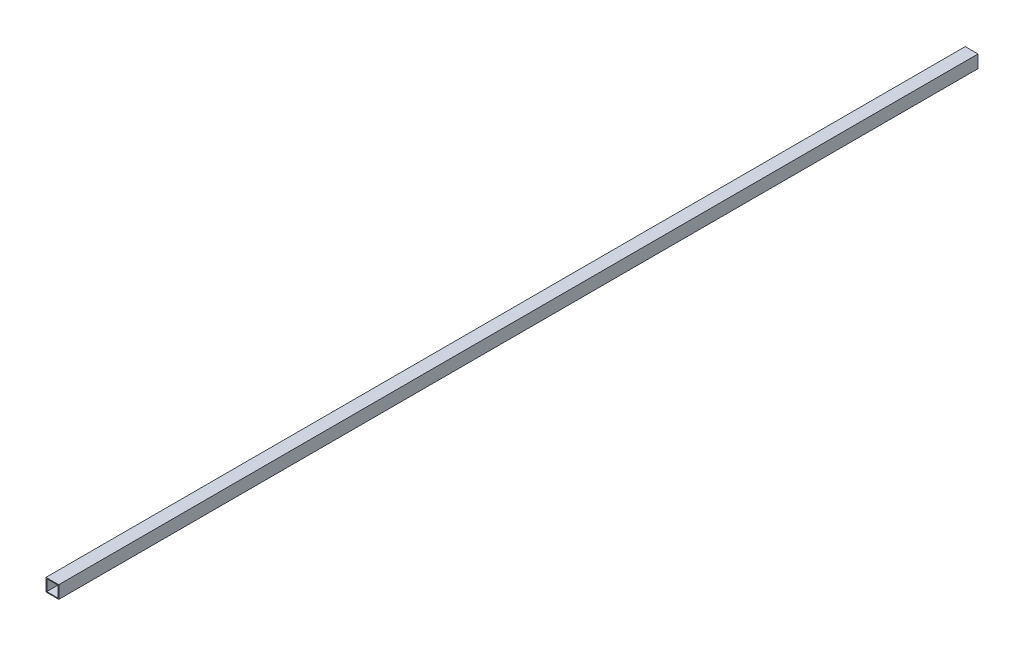
ISO-10303-21;
HEADER;
FILE_DESCRIPTION(('STEP AP214'),'2;1');
FILE_NAME('part.step','',(''),(''),'','','');
FILE_SCHEMA(('AUTOMOTIVE_DESIGN { 1 0 10303 214 1 1 1 1 }'));
ENDSEC;
DATA;
#1=APPLICATION_CONTEXT('core data for automotive mechanical design processes');
#2=APPLICATION_PROTOCOL_DEFINITION('international standard','automotive_design',2000,#1);
#3=PRODUCT_CONTEXT('',#1,'mechanical');
#4=PRODUCT('Part','Part','',(#3));
#5=PRODUCT_RELATED_PRODUCT_CATEGORY('part','',(#4));
#6=PRODUCT_DEFINITION_FORMATION('','',#4);
#7=PRODUCT_DEFINITION_CONTEXT('part definition',#1,'design');
#8=PRODUCT_DEFINITION('design','',#6,#7);
#9=PRODUCT_DEFINITION_SHAPE('','',#8);
#10=(LENGTH_UNIT() NAMED_UNIT(*) SI_UNIT(.MILLI.,.METRE.));
#11=(NAMED_UNIT(*) PLANE_ANGLE_UNIT() SI_UNIT($,.RADIAN.));
#12=(NAMED_UNIT(*) SI_UNIT($,.STERADIAN.) SOLID_ANGLE_UNIT());
#13=UNCERTAINTY_MEASURE_WITH_UNIT(LENGTH_MEASURE(1.E-05),#10,'distance_accuracy_value','');
#14=(GEOMETRIC_REPRESENTATION_CONTEXT(3) GLOBAL_UNCERTAINTY_ASSIGNED_CONTEXT((#13)) GLOBAL_UNIT_ASSIGNED_CONTEXT((#10,
#11,#12)) REPRESENTATION_CONTEXT('',''));
#15=CARTESIAN_POINT('',(0.,0.,0.));
#16=DIRECTION('',(0.,0.,1.));
#17=DIRECTION('',(1.,0.,0.));
#18=AXIS2_PLACEMENT_3D('',#15,#16,#17);
#19=CARTESIAN_POINT('',(25.4,25.4,3657.6));
#20=DIRECTION('',(0.,0.,-1.));
#21=DIRECTION('',(-1.,0.,0.));
#22=AXIS2_PLACEMENT_3D('',#19,#20,#21);
#23=PLANE('',#22);
#24=DIRECTION('',(0.,1.,0.));
#25=VECTOR('',#24,1.);
#26=CARTESIAN_POINT('',(25.4,-25.4,3657.6));
#27=LINE('',#26,#25);
#28=CARTESIAN_POINT('',(25.4,-25.4,3657.6));
#29=VERTEX_POINT('',#28);
#30=CARTESIAN_POINT('',(25.4,25.4,3657.6));
#31=VERTEX_POINT('',#30);
#32=EDGE_CURVE('E130',#29,#31,#27,.T.);
#33=ORIENTED_EDGE('',*,*,#32,.T.);
#34=DIRECTION('',(-1.,0.,0.));
#35=VECTOR('',#34,1.);
#36=CARTESIAN_POINT('',(-25.4,25.4,3657.6));
#37=LINE('',#36,#35);
#38=CARTESIAN_POINT('',(-25.4,25.4,3657.6));
#39=VERTEX_POINT('',#38);
#40=EDGE_CURVE('E133',#31,#39,#37,.T.);
#41=ORIENTED_EDGE('',*,*,#40,.T.);
#42=DIRECTION('',(0.,-1.,0.));
#43=VECTOR('',#42,1.);
#44=CARTESIAN_POINT('',(-25.4,-25.4,3657.6));
#45=LINE('',#44,#43);
#46=CARTESIAN_POINT('',(-25.4,-25.4,3657.6));
#47=VERTEX_POINT('',#46);
#48=EDGE_CURVE('E136',#39,#47,#45,.T.);
#49=ORIENTED_EDGE('',*,*,#48,.T.);
#50=DIRECTION('',(1.,0.,0.));
#51=VECTOR('',#50,1.);
#52=CARTESIAN_POINT('',(-25.4,-25.4,3657.6));
#53=LINE('',#52,#51);
#54=EDGE_CURVE('E138',#47,#29,#53,.T.);
#55=ORIENTED_EDGE('',*,*,#54,.T.);
#56=EDGE_LOOP('',(#33,#41,#49,#55));
#57=FACE_BOUND('',#56,.T.);
#58=DIRECTION('',(0.,1.,0.));
#59=VECTOR('',#58,1.);
#60=CARTESIAN_POINT('',(22.225,25.4,3657.6));
#61=LINE('',#60,#59);
#62=CARTESIAN_POINT('',(22.225,-22.225,3657.6));
#63=VERTEX_POINT('',#62);
#64=CARTESIAN_POINT('',(22.225,22.225,3657.6));
#65=VERTEX_POINT('',#64);
#66=EDGE_CURVE('E118',#63,#65,#61,.T.);
#67=ORIENTED_EDGE('',*,*,#66,.F.);
#68=DIRECTION('',(1.,0.,0.));
#69=VECTOR('',#68,1.);
#70=CARTESIAN_POINT('',(25.4,-22.225,3657.6));
#71=LINE('',#70,#69);
#72=CARTESIAN_POINT('',(-22.225,-22.225,3657.6));
#73=VERTEX_POINT('',#72);
#74=EDGE_CURVE('E103',#73,#63,#71,.T.);
#75=ORIENTED_EDGE('',*,*,#74,.F.);
#76=DIRECTION('',(0.,-1.,0.));
#77=VECTOR('',#76,1.);
#78=CARTESIAN_POINT('',(-22.225,25.4,3657.6));
#79=LINE('',#78,#77);
#80=CARTESIAN_POINT('',(-22.225,22.225,3657.6));
#81=VERTEX_POINT('',#80);
#82=EDGE_CURVE('E127',#81,#73,#79,.T.);
#83=ORIENTED_EDGE('',*,*,#82,.F.);
#84=DIRECTION('',(-1.,0.,0.));
#85=VECTOR('',#84,1.);
#86=CARTESIAN_POINT('',(25.4,22.225,3657.6));
#87=LINE('',#86,#85);
#88=EDGE_CURVE('E120',#65,#81,#87,.T.);
#89=ORIENTED_EDGE('',*,*,#88,.F.);
#90=EDGE_LOOP('',(#67,#75,#83,#89));
#91=FACE_BOUND('',#90,.T.);
#92=ADVANCED_FACE('F33',(#57,#91),#23,.F.);
#93=CARTESIAN_POINT('',(25.4,25.4,0.));
#94=DIRECTION('',(0.,0.,-1.));
#95=DIRECTION('',(-1.,0.,0.));
#96=AXIS2_PLACEMENT_3D('',#93,#94,#95);
#97=PLANE('',#96);
#98=DIRECTION('',(0.,1.,0.));
#99=VECTOR('',#98,1.);
#100=CARTESIAN_POINT('',(25.4,-25.4,0.));
#101=LINE('',#100,#99);
#102=CARTESIAN_POINT('',(25.4,-25.4,0.));
#103=VERTEX_POINT('',#102);
#104=CARTESIAN_POINT('',(25.4,25.4,0.));
#105=VERTEX_POINT('',#104);
#106=EDGE_CURVE('E141',#103,#105,#101,.T.);
#107=ORIENTED_EDGE('',*,*,#106,.F.);
#108=DIRECTION('',(1.,0.,0.));
#109=VECTOR('',#108,1.);
#110=CARTESIAN_POINT('',(-25.4,-25.4,0.));
#111=LINE('',#110,#109);
#112=CARTESIAN_POINT('',(-25.4,-25.4,0.));
#113=VERTEX_POINT('',#112);
#114=EDGE_CURVE('E134',#113,#103,#111,.T.);
#115=ORIENTED_EDGE('',*,*,#114,.F.);
#116=DIRECTION('',(0.,-1.,0.));
#117=VECTOR('',#116,1.);
#118=CARTESIAN_POINT('',(-25.4,-25.4,0.));
#119=LINE('',#118,#117);
#120=CARTESIAN_POINT('',(-25.4,25.4,0.));
#121=VERTEX_POINT('',#120);
#122=EDGE_CURVE('E146',#121,#113,#119,.T.);
#123=ORIENTED_EDGE('',*,*,#122,.F.);
#124=DIRECTION('',(-1.,0.,0.));
#125=VECTOR('',#124,1.);
#126=CARTESIAN_POINT('',(-25.4,25.4,0.));
#127=LINE('',#126,#125);
#128=EDGE_CURVE('E144',#105,#121,#127,.T.);
#129=ORIENTED_EDGE('',*,*,#128,.F.);
#130=EDGE_LOOP('',(#107,#115,#123,#129));
#131=FACE_BOUND('',#130,.T.);
#132=DIRECTION('',(1.,0.,0.));
#133=VECTOR('',#132,1.);
#134=CARTESIAN_POINT('',(25.4,-22.225,0.));
#135=LINE('',#134,#133);
#136=CARTESIAN_POINT('',(-22.225,-22.225,0.));
#137=VERTEX_POINT('',#136);
#138=CARTESIAN_POINT('',(22.225,-22.225,0.));
#139=VERTEX_POINT('',#138);
#140=EDGE_CURVE('E101',#137,#139,#135,.T.);
#141=ORIENTED_EDGE('',*,*,#140,.T.);
#142=DIRECTION('',(0.,1.,0.));
#143=VECTOR('',#142,1.);
#144=CARTESIAN_POINT('',(22.225,25.4,0.));
#145=LINE('',#144,#143);
#146=CARTESIAN_POINT('',(22.225,22.225,0.));
#147=VERTEX_POINT('',#146);
#148=EDGE_CURVE('E109',#139,#147,#145,.T.);
#149=ORIENTED_EDGE('',*,*,#148,.T.);
#150=DIRECTION('',(-1.,0.,0.));
#151=VECTOR('',#150,1.);
#152=CARTESIAN_POINT('',(25.4,22.225,0.));
#153=LINE('',#152,#151);
#154=CARTESIAN_POINT('',(-22.225,22.225,0.));
#155=VERTEX_POINT('',#154);
#156=EDGE_CURVE('E115',#147,#155,#153,.T.);
#157=ORIENTED_EDGE('',*,*,#156,.T.);
#158=DIRECTION('',(0.,-1.,0.));
#159=VECTOR('',#158,1.);
#160=CARTESIAN_POINT('',(-22.225,25.4,0.));
#161=LINE('',#160,#159);
#162=EDGE_CURVE('E55',#155,#137,#161,.T.);
#163=ORIENTED_EDGE('',*,*,#162,.T.);
#164=EDGE_LOOP('',(#141,#149,#157,#163));
#165=FACE_BOUND('',#164,.T.);
#166=ADVANCED_FACE('F117',(#131,#165),#97,.T.);
#167=CARTESIAN_POINT('',(25.4,-25.4,3657.6));
#168=DIRECTION('',(-1.,0.,0.));
#169=DIRECTION('',(0.,0.,1.));
#170=AXIS2_PLACEMENT_3D('',#167,#168,#169);
#171=PLANE('',#170);
#172=ORIENTED_EDGE('',*,*,#106,.T.);
#173=DIRECTION('',(0.,0.,-1.));
#174=VECTOR('',#173,1.);
#175=CARTESIAN_POINT('',(25.4,25.4,3657.6));
#176=LINE('',#175,#174);
#177=EDGE_CURVE('E11',#31,#105,#176,.T.);
#178=ORIENTED_EDGE('',*,*,#177,.F.);
#179=ORIENTED_EDGE('',*,*,#32,.F.);
#180=DIRECTION('',(0.,0.,-1.));
#181=VECTOR('',#180,1.);
#182=CARTESIAN_POINT('',(25.4,-25.4,3657.6));
#183=LINE('',#182,#181);
#184=EDGE_CURVE('E140',#29,#103,#183,.T.);
#185=ORIENTED_EDGE('',*,*,#184,.T.);
#186=EDGE_LOOP('',(#172,#178,#179,#185));
#187=FACE_BOUND('',#186,.T.);
#188=ADVANCED_FACE('F35',(#187),#171,.F.);
#189=CARTESIAN_POINT('',(-25.4,25.4,3657.6));
#190=DIRECTION('',(0.,-1.,0.));
#191=DIRECTION('',(0.,0.,-1.));
#192=AXIS2_PLACEMENT_3D('',#189,#190,#191);
#193=PLANE('',#192);
#194=ORIENTED_EDGE('',*,*,#128,.T.);
#195=DIRECTION('',(0.,0.,-1.));
#196=VECTOR('',#195,1.);
#197=CARTESIAN_POINT('',(-25.4,25.4,3657.6));
#198=LINE('',#197,#196);
#199=EDGE_CURVE('E41',#39,#121,#198,.T.);
#200=ORIENTED_EDGE('',*,*,#199,.F.);
#201=ORIENTED_EDGE('',*,*,#40,.F.);
#202=ORIENTED_EDGE('',*,*,#177,.T.);
#203=EDGE_LOOP('',(#194,#200,#201,#202));
#204=FACE_BOUND('',#203,.T.);
#205=ADVANCED_FACE('F173',(#204),#193,.F.);
#206=CARTESIAN_POINT('',(-25.4,-25.4,3657.6));
#207=DIRECTION('',(1.,0.,0.));
#208=DIRECTION('',(0.,0.,-1.));
#209=AXIS2_PLACEMENT_3D('',#206,#207,#208);
#210=PLANE('',#209);
#211=ORIENTED_EDGE('',*,*,#122,.T.);
#212=DIRECTION('',(0.,0.,-1.));
#213=VECTOR('',#212,1.);
#214=CARTESIAN_POINT('',(-25.4,-25.4,3657.6));
#215=LINE('',#214,#213);
#216=EDGE_CURVE('E151',#47,#113,#215,.T.);
#217=ORIENTED_EDGE('',*,*,#216,.F.);
#218=ORIENTED_EDGE('',*,*,#48,.F.);
#219=ORIENTED_EDGE('',*,*,#199,.T.);
#220=EDGE_LOOP('',(#211,#217,#218,#219));
#221=FACE_BOUND('',#220,.T.);
#222=ADVANCED_FACE('F158',(#221),#210,.F.);
#223=CARTESIAN_POINT('',(-25.4,-25.4,3657.6));
#224=DIRECTION('',(0.,1.,0.));
#225=DIRECTION('',(0.,0.,1.));
#226=AXIS2_PLACEMENT_3D('',#223,#224,#225);
#227=PLANE('',#226);
#228=ORIENTED_EDGE('',*,*,#114,.T.);
#229=ORIENTED_EDGE('',*,*,#184,.F.);
#230=ORIENTED_EDGE('',*,*,#54,.F.);
#231=ORIENTED_EDGE('',*,*,#216,.T.);
#232=EDGE_LOOP('',(#228,#229,#230,#231));
#233=FACE_BOUND('',#232,.T.);
#234=ADVANCED_FACE('F166',(#233),#227,.F.);
#235=CARTESIAN_POINT('',(22.225,-25.4,3657.6));
#236=DIRECTION('',(-1.,0.,0.));
#237=DIRECTION('',(0.,0.,1.));
#238=AXIS2_PLACEMENT_3D('',#235,#236,#237);
#239=PLANE('',#238);
#240=ORIENTED_EDGE('',*,*,#148,.F.);
#241=DIRECTION('',(0.,0.,-1.));
#242=VECTOR('',#241,1.);
#243=CARTESIAN_POINT('',(22.225,-22.225,3657.6));
#244=LINE('',#243,#242);
#245=EDGE_CURVE('E97',#63,#139,#244,.T.);
#246=ORIENTED_EDGE('',*,*,#245,.F.);
#247=ORIENTED_EDGE('',*,*,#66,.T.);
#248=DIRECTION('',(0.,0.,-1.));
#249=VECTOR('',#248,1.);
#250=CARTESIAN_POINT('',(22.225,22.225,3657.6));
#251=LINE('',#250,#249);
#252=EDGE_CURVE('E112',#65,#147,#251,.T.);
#253=ORIENTED_EDGE('',*,*,#252,.T.);
#254=EDGE_LOOP('',(#240,#246,#247,#253));
#255=FACE_BOUND('',#254,.T.);
#256=ADVANCED_FACE('F110',(#255),#239,.T.);
#257=CARTESIAN_POINT('',(-25.4,22.225,3657.6));
#258=DIRECTION('',(0.,-1.,0.));
#259=DIRECTION('',(0.,0.,-1.));
#260=AXIS2_PLACEMENT_3D('',#257,#258,#259);
#261=PLANE('',#260);
#262=ORIENTED_EDGE('',*,*,#156,.F.);
#263=ORIENTED_EDGE('',*,*,#252,.F.);
#264=ORIENTED_EDGE('',*,*,#88,.T.);
#265=DIRECTION('',(0.,0.,-1.));
#266=VECTOR('',#265,1.);
#267=CARTESIAN_POINT('',(-22.225,22.225,3657.6));
#268=LINE('',#267,#266);
#269=EDGE_CURVE('E256',#81,#155,#268,.T.);
#270=ORIENTED_EDGE('',*,*,#269,.T.);
#271=EDGE_LOOP('',(#262,#263,#264,#270));
#272=FACE_BOUND('',#271,.T.);
#273=ADVANCED_FACE('F193',(#272),#261,.T.);
#274=CARTESIAN_POINT('',(-22.225,-25.4,3657.6));
#275=DIRECTION('',(1.,0.,0.));
#276=DIRECTION('',(0.,0.,-1.));
#277=AXIS2_PLACEMENT_3D('',#274,#275,#276);
#278=PLANE('',#277);
#279=ORIENTED_EDGE('',*,*,#162,.F.);
#280=ORIENTED_EDGE('',*,*,#269,.F.);
#281=ORIENTED_EDGE('',*,*,#82,.T.);
#282=DIRECTION('',(0.,0.,-1.));
#283=VECTOR('',#282,1.);
#284=CARTESIAN_POINT('',(-22.225,-22.225,3657.6));
#285=LINE('',#284,#283);
#286=EDGE_CURVE('E48',#73,#137,#285,.T.);
#287=ORIENTED_EDGE('',*,*,#286,.T.);
#288=EDGE_LOOP('',(#279,#280,#281,#287));
#289=FACE_BOUND('',#288,.T.);
#290=ADVANCED_FACE('F198',(#289),#278,.T.);
#291=CARTESIAN_POINT('',(-25.4,-22.225,3657.6));
#292=DIRECTION('',(0.,1.,0.));
#293=DIRECTION('',(0.,0.,1.));
#294=AXIS2_PLACEMENT_3D('',#291,#292,#293);
#295=PLANE('',#294);
#296=ORIENTED_EDGE('',*,*,#140,.F.);
#297=ORIENTED_EDGE('',*,*,#286,.F.);
#298=ORIENTED_EDGE('',*,*,#74,.T.);
#299=ORIENTED_EDGE('',*,*,#245,.T.);
#300=EDGE_LOOP('',(#296,#297,#298,#299));
#301=FACE_BOUND('',#300,.T.);
#302=ADVANCED_FACE('F99',(#301),#295,.T.);
#303=CLOSED_SHELL('',(#92,#166,#188,#205,#222,#234,#256,#273,#290,#302));
#304=MANIFOLD_SOLID_BREP('B2',#303);
#305=ADVANCED_BREP_SHAPE_REPRESENTATION('',(#18,#304),#14);
#306=SHAPE_DEFINITION_REPRESENTATION(#9,#305);
ENDSEC;
END-ISO-10303-21;
